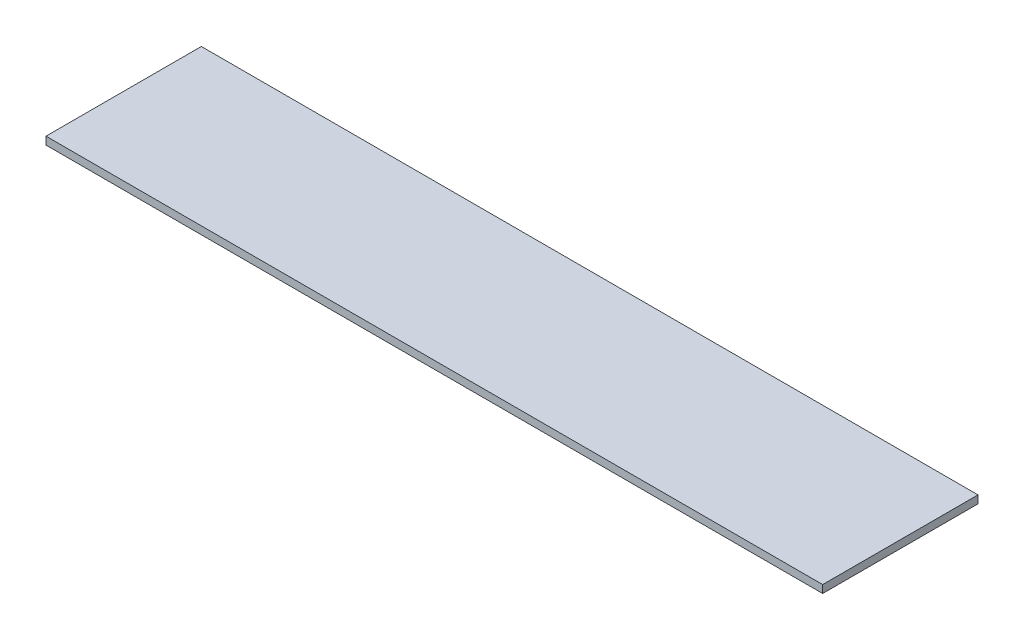
ISO-10303-21;
HEADER;
FILE_DESCRIPTION(('STEP AP214'),'2;1');
FILE_NAME('part.step','',(''),(''),'','','');
FILE_SCHEMA(('AUTOMOTIVE_DESIGN { 1 0 10303 214 1 1 1 1 }'));
ENDSEC;
DATA;
#1=APPLICATION_CONTEXT('core data for automotive mechanical design processes');
#2=APPLICATION_PROTOCOL_DEFINITION('international standard','automotive_design',2000,#1);
#3=PRODUCT_CONTEXT('',#1,'mechanical');
#4=PRODUCT('Part','Part','',(#3));
#5=PRODUCT_RELATED_PRODUCT_CATEGORY('part','',(#4));
#6=PRODUCT_DEFINITION_FORMATION('','',#4);
#7=PRODUCT_DEFINITION_CONTEXT('part definition',#1,'design');
#8=PRODUCT_DEFINITION('design','',#6,#7);
#9=PRODUCT_DEFINITION_SHAPE('','',#8);
#10=(LENGTH_UNIT() NAMED_UNIT(*) SI_UNIT(.MILLI.,.METRE.));
#11=(NAMED_UNIT(*) PLANE_ANGLE_UNIT() SI_UNIT($,.RADIAN.));
#12=(NAMED_UNIT(*) SI_UNIT($,.STERADIAN.) SOLID_ANGLE_UNIT());
#13=UNCERTAINTY_MEASURE_WITH_UNIT(LENGTH_MEASURE(1.E-05),#10,'distance_accuracy_value','');
#14=(GEOMETRIC_REPRESENTATION_CONTEXT(3) GLOBAL_UNCERTAINTY_ASSIGNED_CONTEXT((#13)) GLOBAL_UNIT_ASSIGNED_CONTEXT((#10,
#11,#12)) REPRESENTATION_CONTEXT('',''));
#15=CARTESIAN_POINT('',(0.,0.,0.));
#16=DIRECTION('',(0.,0.,1.));
#17=DIRECTION('',(1.,0.,0.));
#18=AXIS2_PLACEMENT_3D('',#15,#16,#17);
#19=CARTESIAN_POINT('',(900.,18.,-180.));
#20=DIRECTION('',(-1.,0.,0.));
#21=DIRECTION('',(0.,0.,1.));
#22=AXIS2_PLACEMENT_3D('',#19,#20,#21);
#23=PLANE('',#22);
#24=DIRECTION('',(0.,0.,-1.));
#25=VECTOR('',#24,1.);
#26=CARTESIAN_POINT('',(900.,0.,-180.));
#27=LINE('',#26,#25);
#28=CARTESIAN_POINT('',(900.,0.,180.));
#29=VERTEX_POINT('',#28);
#30=CARTESIAN_POINT('',(900.,0.,-180.));
#31=VERTEX_POINT('',#30);
#32=EDGE_CURVE('E97',#29,#31,#27,.T.);
#33=ORIENTED_EDGE('',*,*,#32,.T.);
#34=DIRECTION('',(0.,-1.,0.));
#35=VECTOR('',#34,1.);
#36=CARTESIAN_POINT('',(900.,18.,-180.));
#37=LINE('',#36,#35);
#38=CARTESIAN_POINT('',(900.,18.,-180.));
#39=VERTEX_POINT('',#38);
#40=EDGE_CURVE('E11',#39,#31,#37,.T.);
#41=ORIENTED_EDGE('',*,*,#40,.F.);
#42=DIRECTION('',(0.,0.,-1.));
#43=VECTOR('',#42,1.);
#44=CARTESIAN_POINT('',(900.,18.,-180.));
#45=LINE('',#44,#43);
#46=CARTESIAN_POINT('',(900.,18.,180.));
#47=VERTEX_POINT('',#46);
#48=EDGE_CURVE('E85',#47,#39,#45,.T.);
#49=ORIENTED_EDGE('',*,*,#48,.F.);
#50=DIRECTION('',(0.,-1.,0.));
#51=VECTOR('',#50,1.);
#52=CARTESIAN_POINT('',(900.,18.,180.));
#53=LINE('',#52,#51);
#54=EDGE_CURVE('E93',#47,#29,#53,.T.);
#55=ORIENTED_EDGE('',*,*,#54,.T.);
#56=EDGE_LOOP('',(#33,#41,#49,#55));
#57=FACE_BOUND('',#56,.T.);
#58=ADVANCED_FACE('F34',(#57),#23,.F.);
#59=CARTESIAN_POINT('',(-900.,18.,-180.));
#60=DIRECTION('',(0.,0.,1.));
#61=DIRECTION('',(1.,0.,0.));
#62=AXIS2_PLACEMENT_3D('',#59,#60,#61);
#63=PLANE('',#62);
#64=DIRECTION('',(-1.,0.,0.));
#65=VECTOR('',#64,1.);
#66=CARTESIAN_POINT('',(-900.,0.,-180.));
#67=LINE('',#66,#65);
#68=CARTESIAN_POINT('',(-900.,0.,-180.));
#69=VERTEX_POINT('',#68);
#70=EDGE_CURVE('E89',#31,#69,#67,.T.);
#71=ORIENTED_EDGE('',*,*,#70,.T.);
#72=DIRECTION('',(0.,-1.,0.));
#73=VECTOR('',#72,1.);
#74=CARTESIAN_POINT('',(-900.,18.,-180.));
#75=LINE('',#74,#73);
#76=CARTESIAN_POINT('',(-900.,18.,-180.));
#77=VERTEX_POINT('',#76);
#78=EDGE_CURVE('E42',#77,#69,#75,.T.);
#79=ORIENTED_EDGE('',*,*,#78,.F.);
#80=DIRECTION('',(-1.,0.,0.));
#81=VECTOR('',#80,1.);
#82=CARTESIAN_POINT('',(-900.,18.,-180.));
#83=LINE('',#82,#81);
#84=EDGE_CURVE('E80',#39,#77,#83,.T.);
#85=ORIENTED_EDGE('',*,*,#84,.F.);
#86=ORIENTED_EDGE('',*,*,#40,.T.);
#87=EDGE_LOOP('',(#71,#79,#85,#86));
#88=FACE_BOUND('',#87,.T.);
#89=ADVANCED_FACE('F88',(#88),#63,.F.);
#90=CARTESIAN_POINT('',(-900.,18.,-180.));
#91=DIRECTION('',(1.,0.,0.));
#92=DIRECTION('',(0.,0.,-1.));
#93=AXIS2_PLACEMENT_3D('',#90,#91,#92);
#94=PLANE('',#93);
#95=DIRECTION('',(0.,0.,1.));
#96=VECTOR('',#95,1.);
#97=CARTESIAN_POINT('',(-900.,0.,-180.));
#98=LINE('',#97,#96);
#99=CARTESIAN_POINT('',(-900.,0.,180.));
#100=VERTEX_POINT('',#99);
#101=EDGE_CURVE('E67',#69,#100,#98,.T.);
#102=ORIENTED_EDGE('',*,*,#101,.T.);
#103=DIRECTION('',(0.,-1.,0.));
#104=VECTOR('',#103,1.);
#105=CARTESIAN_POINT('',(-900.,18.,180.));
#106=LINE('',#105,#104);
#107=CARTESIAN_POINT('',(-900.,18.,180.));
#108=VERTEX_POINT('',#107);
#109=EDGE_CURVE('E90',#108,#100,#106,.T.);
#110=ORIENTED_EDGE('',*,*,#109,.F.);
#111=DIRECTION('',(0.,0.,1.));
#112=VECTOR('',#111,1.);
#113=CARTESIAN_POINT('',(-900.,18.,-180.));
#114=LINE('',#113,#112);
#115=EDGE_CURVE('E83',#77,#108,#114,.T.);
#116=ORIENTED_EDGE('',*,*,#115,.F.);
#117=ORIENTED_EDGE('',*,*,#78,.T.);
#118=EDGE_LOOP('',(#102,#110,#116,#117));
#119=FACE_BOUND('',#118,.T.);
#120=ADVANCED_FACE('F91',(#119),#94,.F.);
#121=CARTESIAN_POINT('',(-900.,18.,180.));
#122=DIRECTION('',(0.,0.,-1.));
#123=DIRECTION('',(-1.,0.,0.));
#124=AXIS2_PLACEMENT_3D('',#121,#122,#123);
#125=PLANE('',#124);
#126=DIRECTION('',(1.,0.,0.));
#127=VECTOR('',#126,1.);
#128=CARTESIAN_POINT('',(-900.,0.,180.));
#129=LINE('',#128,#127);
#130=EDGE_CURVE('E73',#100,#29,#129,.T.);
#131=ORIENTED_EDGE('',*,*,#130,.T.);
#132=ORIENTED_EDGE('',*,*,#54,.F.);
#133=DIRECTION('',(1.,0.,0.));
#134=VECTOR('',#133,1.);
#135=CARTESIAN_POINT('',(-900.,18.,180.));
#136=LINE('',#135,#134);
#137=EDGE_CURVE('E50',#108,#47,#136,.T.);
#138=ORIENTED_EDGE('',*,*,#137,.F.);
#139=ORIENTED_EDGE('',*,*,#109,.T.);
#140=EDGE_LOOP('',(#131,#132,#138,#139));
#141=FACE_BOUND('',#140,.T.);
#142=ADVANCED_FACE('F104',(#141),#125,.F.);
#143=CARTESIAN_POINT('',(0.,18.,0.));
#144=DIRECTION('',(0.,1.,0.));
#145=DIRECTION('',(0.,0.,1.));
#146=AXIS2_PLACEMENT_3D('',#143,#144,#145);
#147=PLANE('',#146);
#148=ORIENTED_EDGE('',*,*,#48,.T.);
#149=ORIENTED_EDGE('',*,*,#84,.T.);
#150=ORIENTED_EDGE('',*,*,#115,.T.);
#151=ORIENTED_EDGE('',*,*,#137,.T.);
#152=EDGE_LOOP('',(#148,#149,#150,#151));
#153=FACE_BOUND('',#152,.T.);
#154=ADVANCED_FACE('F81',(#153),#147,.T.);
#155=CARTESIAN_POINT('',(0.,0.,0.));
#156=DIRECTION('',(0.,1.,0.));
#157=DIRECTION('',(0.,0.,1.));
#158=AXIS2_PLACEMENT_3D('',#155,#156,#157);
#159=PLANE('',#158);
#160=ORIENTED_EDGE('',*,*,#32,.F.);
#161=ORIENTED_EDGE('',*,*,#130,.F.);
#162=ORIENTED_EDGE('',*,*,#101,.F.);
#163=ORIENTED_EDGE('',*,*,#70,.F.);
#164=EDGE_LOOP('',(#160,#161,#162,#163));
#165=FACE_BOUND('',#164,.T.);
#166=ADVANCED_FACE('F107',(#165),#159,.F.);
#167=CLOSED_SHELL('',(#58,#89,#120,#142,#154,#166));
#168=MANIFOLD_SOLID_BREP('B2',#167);
#169=ADVANCED_BREP_SHAPE_REPRESENTATION('',(#18,#168),#14);
#170=SHAPE_DEFINITION_REPRESENTATION(#9,#169);
ENDSEC;
END-ISO-10303-21;
